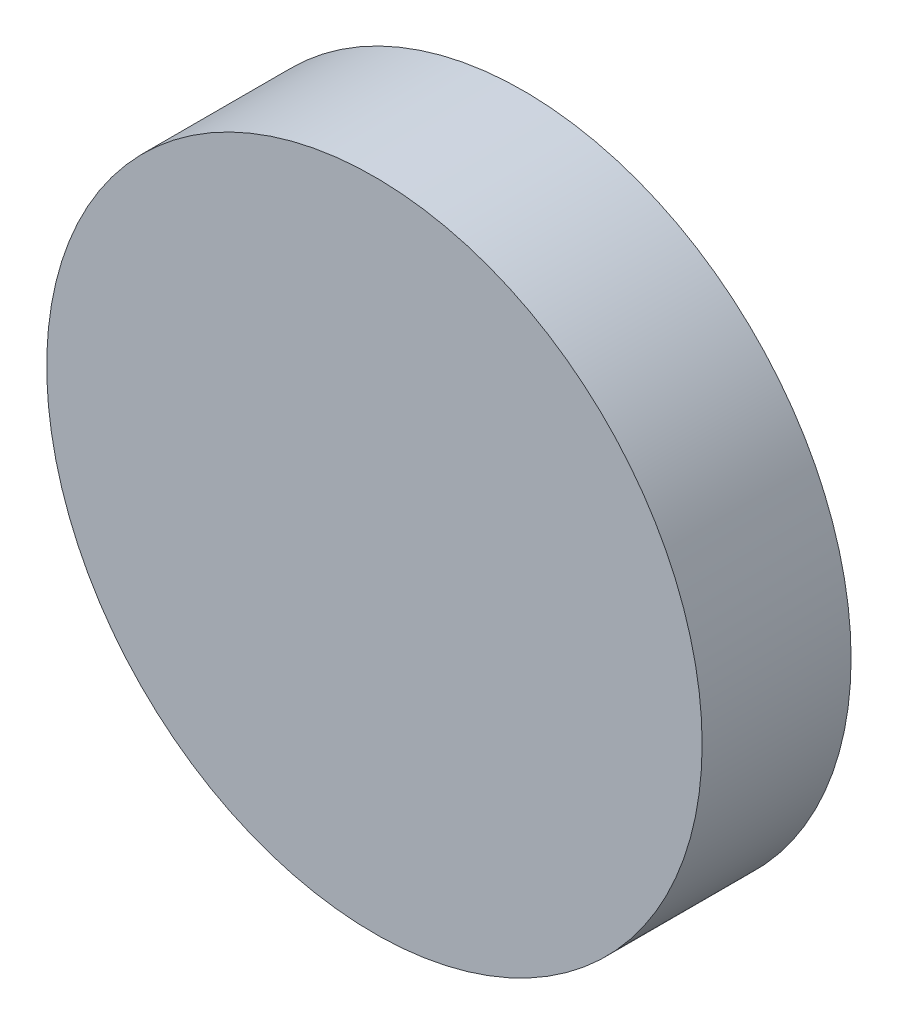
ISO-10303-21;
HEADER;
FILE_DESCRIPTION(('STEP AP214'),'2;1');
FILE_NAME('part.step','',(''),(''),'','','');
FILE_SCHEMA(('AUTOMOTIVE_DESIGN { 1 0 10303 214 1 1 1 1 }'));
ENDSEC;
DATA;
#1=APPLICATION_CONTEXT('core data for automotive mechanical design processes');
#2=APPLICATION_PROTOCOL_DEFINITION('international standard','automotive_design',2000,#1);
#3=PRODUCT_CONTEXT('',#1,'mechanical');
#4=PRODUCT('Part','Part','',(#3));
#5=PRODUCT_RELATED_PRODUCT_CATEGORY('part','',(#4));
#6=PRODUCT_DEFINITION_FORMATION('','',#4);
#7=PRODUCT_DEFINITION_CONTEXT('part definition',#1,'design');
#8=PRODUCT_DEFINITION('design','',#6,#7);
#9=PRODUCT_DEFINITION_SHAPE('','',#8);
#10=(LENGTH_UNIT() NAMED_UNIT(*) SI_UNIT(.MILLI.,.METRE.));
#11=(NAMED_UNIT(*) PLANE_ANGLE_UNIT() SI_UNIT($,.RADIAN.));
#12=(NAMED_UNIT(*) SI_UNIT($,.STERADIAN.) SOLID_ANGLE_UNIT());
#13=UNCERTAINTY_MEASURE_WITH_UNIT(LENGTH_MEASURE(1.E-05),#10,'distance_accuracy_value','');
#14=(GEOMETRIC_REPRESENTATION_CONTEXT(3) GLOBAL_UNCERTAINTY_ASSIGNED_CONTEXT((#13)) GLOBAL_UNIT_ASSIGNED_CONTEXT((#10,
#11,#12)) REPRESENTATION_CONTEXT('',''));
#15=CARTESIAN_POINT('',(0.,0.,0.));
#16=DIRECTION('',(0.,0.,1.));
#17=DIRECTION('',(1.,0.,0.));
#18=AXIS2_PLACEMENT_3D('',#15,#16,#17);
#19=CARTESIAN_POINT('',(0.,0.,-25.));
#20=DIRECTION('',(0.,0.,1.));
#21=DIRECTION('',(1.,0.,0.));
#22=AXIS2_PLACEMENT_3D('',#19,#20,#21);
#23=CYLINDRICAL_SURFACE('',#22,55.);
#24=CARTESIAN_POINT('',(0.,0.,-25.));
#25=DIRECTION('',(0.,0.,1.));
#26=DIRECTION('',(1.,0.,0.));
#27=AXIS2_PLACEMENT_3D('',#24,#25,#26);
#28=CIRCLE('',#27,55.);
#29=CARTESIAN_POINT('',(55.,0.,-25.));
#30=VERTEX_POINT('',#29);
#31=EDGE_CURVE('E10',#30,#30,#28,.T.);
#32=ORIENTED_EDGE('',*,*,#31,.T.);
#33=EDGE_LOOP('',(#32));
#34=FACE_BOUND('',#33,.T.);
#35=CARTESIAN_POINT('',(0.,0.,0.));
#36=DIRECTION('',(0.,0.,1.));
#37=DIRECTION('',(1.,0.,0.));
#38=AXIS2_PLACEMENT_3D('',#35,#36,#37);
#39=CIRCLE('',#38,55.);
#40=CARTESIAN_POINT('',(55.,0.,0.));
#41=VERTEX_POINT('',#40);
#42=EDGE_CURVE('E37',#41,#41,#39,.T.);
#43=ORIENTED_EDGE('',*,*,#42,.F.);
#44=EDGE_LOOP('',(#43));
#45=FACE_BOUND('',#44,.T.);
#46=ADVANCED_FACE('F40',(#34,#45),#23,.T.);
#47=CARTESIAN_POINT('',(0.,0.,-25.));
#48=DIRECTION('',(0.,0.,1.));
#49=DIRECTION('',(1.,0.,0.));
#50=AXIS2_PLACEMENT_3D('',#47,#48,#49);
#51=PLANE('',#50);
#52=ORIENTED_EDGE('',*,*,#31,.F.);
#53=EDGE_LOOP('',(#52));
#54=FACE_BOUND('',#53,.T.);
#55=ADVANCED_FACE('F55',(#54),#51,.F.);
#56=CARTESIAN_POINT('',(0.,0.,0.));
#57=DIRECTION('',(0.,0.,1.));
#58=DIRECTION('',(1.,0.,0.));
#59=AXIS2_PLACEMENT_3D('',#56,#57,#58);
#60=PLANE('',#59);
#61=ORIENTED_EDGE('',*,*,#42,.T.);
#62=EDGE_LOOP('',(#61));
#63=FACE_BOUND('',#62,.T.);
#64=ADVANCED_FACE('F47',(#63),#60,.T.);
#65=CLOSED_SHELL('',(#46,#55,#64));
#66=MANIFOLD_SOLID_BREP('B2',#65);
#67=ADVANCED_BREP_SHAPE_REPRESENTATION('',(#18,#66),#14);
#68=SHAPE_DEFINITION_REPRESENTATION(#9,#67);
ENDSEC;
END-ISO-10303-21;
